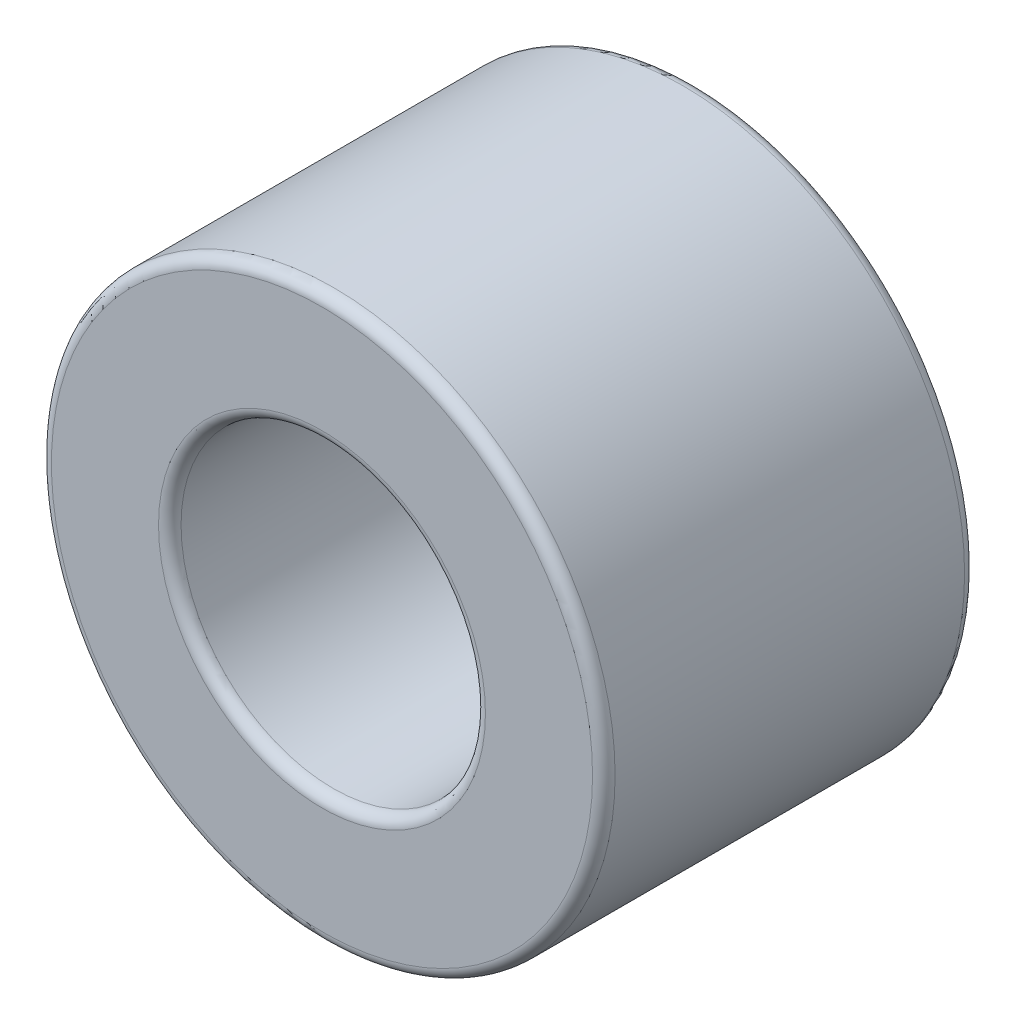
ISO-10303-21;
HEADER;
FILE_DESCRIPTION(('STEP AP214'),'2;1');
FILE_NAME('part.step','',(''),(''),'','','');
FILE_SCHEMA(('AUTOMOTIVE_DESIGN { 1 0 10303 214 1 1 1 1 }'));
ENDSEC;
DATA;
#1=APPLICATION_CONTEXT('core data for automotive mechanical design processes');
#2=APPLICATION_PROTOCOL_DEFINITION('international standard','automotive_design',2000,#1);
#3=PRODUCT_CONTEXT('',#1,'mechanical');
#4=PRODUCT('Part','Part','',(#3));
#5=PRODUCT_RELATED_PRODUCT_CATEGORY('part','',(#4));
#6=PRODUCT_DEFINITION_FORMATION('','',#4);
#7=PRODUCT_DEFINITION_CONTEXT('part definition',#1,'design');
#8=PRODUCT_DEFINITION('design','',#6,#7);
#9=PRODUCT_DEFINITION_SHAPE('','',#8);
#10=(LENGTH_UNIT() NAMED_UNIT(*) SI_UNIT(.MILLI.,.METRE.));
#11=(NAMED_UNIT(*) PLANE_ANGLE_UNIT() SI_UNIT($,.RADIAN.));
#12=(NAMED_UNIT(*) SI_UNIT($,.STERADIAN.) SOLID_ANGLE_UNIT());
#13=UNCERTAINTY_MEASURE_WITH_UNIT(LENGTH_MEASURE(1.E-05),#10,'distance_accuracy_value','');
#14=(GEOMETRIC_REPRESENTATION_CONTEXT(3) GLOBAL_UNCERTAINTY_ASSIGNED_CONTEXT((#13)) GLOBAL_UNIT_ASSIGNED_CONTEXT((#10,
#11,#12)) REPRESENTATION_CONTEXT('',''));
#15=CARTESIAN_POINT('',(0.,0.,0.));
#16=DIRECTION('',(0.,0.,1.));
#17=DIRECTION('',(1.,0.,0.));
#18=AXIS2_PLACEMENT_3D('',#15,#16,#17);
#19=CARTESIAN_POINT('',(0.,0.,4.191));
#20=DIRECTION('',(0.,0.,-1.));
#21=DIRECTION('',(-1.,0.,0.));
#22=AXIS2_PLACEMENT_3D('',#19,#20,#21);
#23=CYLINDRICAL_SURFACE('',#22,1.7145);
#24=CARTESIAN_POINT('',(0.,0.,4.064));
#25=DIRECTION('',(0.,0.,1.));
#26=DIRECTION('',(1.,0.,0.));
#27=AXIS2_PLACEMENT_3D('',#24,#25,#26);
#28=CIRCLE('',#27,1.7145);
#29=CARTESIAN_POINT('',(1.7145,0.,4.064));
#30=VERTEX_POINT('',#29);
#31=EDGE_CURVE('E110',#30,#30,#28,.F.);
#32=ORIENTED_EDGE('',*,*,#31,.F.);
#33=EDGE_LOOP('',(#32));
#34=FACE_BOUND('',#33,.T.);
#35=CARTESIAN_POINT('',(0.,0.,0.127));
#36=DIRECTION('',(0.,0.,1.));
#37=DIRECTION('',(1.,0.,0.));
#38=AXIS2_PLACEMENT_3D('',#35,#36,#37);
#39=CIRCLE('',#38,1.7145);
#40=CARTESIAN_POINT('',(1.7145,0.,0.127));
#41=VERTEX_POINT('',#40);
#42=EDGE_CURVE('E113',#41,#41,#39,.T.);
#43=ORIENTED_EDGE('',*,*,#42,.F.);
#44=EDGE_LOOP('',(#43));
#45=FACE_BOUND('',#44,.T.);
#46=ADVANCED_FACE('F15',(#34,#45),#23,.F.);
#47=CARTESIAN_POINT('',(0.,0.,0.127));
#48=DIRECTION('',(0.,0.,1.));
#49=DIRECTION('',(1.,0.,0.));
#50=AXIS2_PLACEMENT_3D('',#47,#48,#49);
#51=TOROIDAL_SURFACE('',#50,1.8415,0.127);
#52=CARTESIAN_POINT('',(0.,0.,0.));
#53=DIRECTION('',(0.,0.,-1.));
#54=DIRECTION('',(1.,0.,0.));
#55=AXIS2_PLACEMENT_3D('',#52,#53,#54);
#56=CIRCLE('',#55,1.8415);
#57=CARTESIAN_POINT('',(1.8415,0.,0.));
#58=VERTEX_POINT('',#57);
#59=EDGE_CURVE('E66',#58,#58,#56,.T.);
#60=ORIENTED_EDGE('',*,*,#59,.T.);
#61=EDGE_LOOP('',(#60));
#62=FACE_BOUND('',#61,.T.);
#63=ORIENTED_EDGE('',*,*,#42,.T.);
#64=EDGE_LOOP('',(#63));
#65=FACE_BOUND('',#64,.T.);
#66=ADVANCED_FACE('F132',(#62,#65),#51,.T.);
#67=CARTESIAN_POINT('',(0.,0.,4.064));
#68=DIRECTION('',(0.,0.,1.));
#69=DIRECTION('',(1.,0.,0.));
#70=AXIS2_PLACEMENT_3D('',#67,#68,#69);
#71=TOROIDAL_SURFACE('',#70,1.8415,0.127);
#72=ORIENTED_EDGE('',*,*,#31,.T.);
#73=EDGE_LOOP('',(#72));
#74=FACE_BOUND('',#73,.T.);
#75=CARTESIAN_POINT('',(0.,0.,4.191));
#76=DIRECTION('',(0.,0.,1.));
#77=DIRECTION('',(1.,0.,0.));
#78=AXIS2_PLACEMENT_3D('',#75,#76,#77);
#79=CIRCLE('',#78,1.8415);
#80=CARTESIAN_POINT('',(1.8415,0.,4.191));
#81=VERTEX_POINT('',#80);
#82=EDGE_CURVE('E120',#81,#81,#79,.F.);
#83=ORIENTED_EDGE('',*,*,#82,.F.);
#84=EDGE_LOOP('',(#83));
#85=FACE_BOUND('',#84,.T.);
#86=ADVANCED_FACE('F83',(#74,#85),#71,.T.);
#87=CARTESIAN_POINT('',(0.,0.,0.));
#88=DIRECTION('',(0.,0.,1.));
#89=DIRECTION('',(1.,0.,0.));
#90=AXIS2_PLACEMENT_3D('',#87,#88,#89);
#91=PLANE('',#90);
#92=CARTESIAN_POINT('',(0.,0.,0.));
#93=DIRECTION('',(0.,0.,1.));
#94=DIRECTION('',(1.,0.,0.));
#95=AXIS2_PLACEMENT_3D('',#92,#93,#94);
#96=CIRCLE('',#95,3.048);
#97=CARTESIAN_POINT('',(3.048,0.,0.));
#98=VERTEX_POINT('',#97);
#99=EDGE_CURVE('E100',#98,#98,#96,.T.);
#100=ORIENTED_EDGE('',*,*,#99,.F.);
#101=EDGE_LOOP('',(#100));
#102=FACE_BOUND('',#101,.T.);
#103=ORIENTED_EDGE('',*,*,#59,.F.);
#104=EDGE_LOOP('',(#103));
#105=FACE_BOUND('',#104,.T.);
#106=ADVANCED_FACE('F73',(#102,#105),#91,.F.);
#107=CARTESIAN_POINT('',(0.,0.,4.191));
#108=DIRECTION('',(0.,0.,1.));
#109=DIRECTION('',(1.,0.,0.));
#110=AXIS2_PLACEMENT_3D('',#107,#108,#109);
#111=PLANE('',#110);
#112=ORIENTED_EDGE('',*,*,#82,.T.);
#113=EDGE_LOOP('',(#112));
#114=FACE_BOUND('',#113,.T.);
#115=CARTESIAN_POINT('',(0.,0.,4.191));
#116=DIRECTION('',(0.,0.,-1.));
#117=DIRECTION('',(1.,0.,0.));
#118=AXIS2_PLACEMENT_3D('',#115,#116,#117);
#119=CIRCLE('',#118,3.048);
#120=CARTESIAN_POINT('',(3.048,0.,4.191));
#121=VERTEX_POINT('',#120);
#122=EDGE_CURVE('E28',#121,#121,#119,.T.);
#123=ORIENTED_EDGE('',*,*,#122,.F.);
#124=EDGE_LOOP('',(#123));
#125=FACE_BOUND('',#124,.T.);
#126=ADVANCED_FACE('F82',(#114,#125),#111,.T.);
#127=CARTESIAN_POINT('',(0.,0.,0.127));
#128=DIRECTION('',(0.,0.,1.));
#129=DIRECTION('',(1.,0.,0.));
#130=AXIS2_PLACEMENT_3D('',#127,#128,#129);
#131=TOROIDAL_SURFACE('',#130,3.048,0.127);
#132=CARTESIAN_POINT('',(0.,0.,0.127));
#133=DIRECTION('',(0.,0.,-1.));
#134=DIRECTION('',(-1.,0.,0.));
#135=AXIS2_PLACEMENT_3D('',#132,#133,#134);
#136=CIRCLE('',#135,3.175);
#137=CARTESIAN_POINT('',(-3.175,0.,0.127));
#138=VERTEX_POINT('',#137);
#139=EDGE_CURVE('E23',#138,#138,#136,.F.);
#140=ORIENTED_EDGE('',*,*,#139,.F.);
#141=EDGE_LOOP('',(#140));
#142=FACE_BOUND('',#141,.T.);
#143=ORIENTED_EDGE('',*,*,#99,.T.);
#144=EDGE_LOOP('',(#143));
#145=FACE_BOUND('',#144,.T.);
#146=ADVANCED_FACE('F46',(#142,#145),#131,.T.);
#147=CARTESIAN_POINT('',(0.,0.,4.064));
#148=DIRECTION('',(0.,0.,1.));
#149=DIRECTION('',(1.,0.,0.));
#150=AXIS2_PLACEMENT_3D('',#147,#148,#149);
#151=TOROIDAL_SURFACE('',#150,3.048,0.127);
#152=ORIENTED_EDGE('',*,*,#122,.T.);
#153=EDGE_LOOP('',(#152));
#154=FACE_BOUND('',#153,.T.);
#155=CARTESIAN_POINT('',(0.,0.,4.064));
#156=DIRECTION('',(0.,0.,-1.));
#157=DIRECTION('',(-1.,0.,0.));
#158=AXIS2_PLACEMENT_3D('',#155,#156,#157);
#159=CIRCLE('',#158,3.175);
#160=CARTESIAN_POINT('',(-3.175,0.,4.064));
#161=VERTEX_POINT('',#160);
#162=EDGE_CURVE('E10',#161,#161,#159,.T.);
#163=ORIENTED_EDGE('',*,*,#162,.F.);
#164=EDGE_LOOP('',(#163));
#165=FACE_BOUND('',#164,.T.);
#166=ADVANCED_FACE('F40',(#154,#165),#151,.T.);
#167=CARTESIAN_POINT('',(0.,0.,4.191));
#168=DIRECTION('',(0.,0.,-1.));
#169=DIRECTION('',(-1.,0.,0.));
#170=AXIS2_PLACEMENT_3D('',#167,#168,#169);
#171=CYLINDRICAL_SURFACE('',#170,3.175);
#172=ORIENTED_EDGE('',*,*,#162,.T.);
#173=EDGE_LOOP('',(#172));
#174=FACE_BOUND('',#173,.T.);
#175=ORIENTED_EDGE('',*,*,#139,.T.);
#176=EDGE_LOOP('',(#175));
#177=FACE_BOUND('',#176,.T.);
#178=ADVANCED_FACE('F45',(#174,#177),#171,.T.);
#179=CLOSED_SHELL('',(#46,#66,#86,#106,#126,#146,#166,#178));
#180=MANIFOLD_SOLID_BREP('B1',#179);
#181=ADVANCED_BREP_SHAPE_REPRESENTATION('',(#18,#180),#14);
#182=SHAPE_DEFINITION_REPRESENTATION(#9,#181);
ENDSEC;
END-ISO-10303-21;
